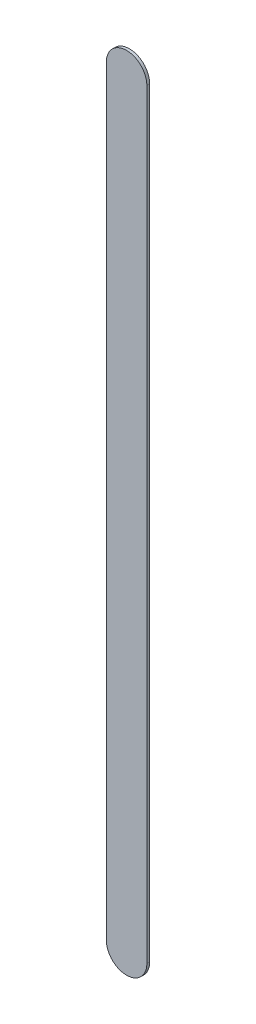
ISO-10303-21;
HEADER;
FILE_DESCRIPTION(('STEP AP214'),'2;1');
FILE_NAME('part.step','',(''),(''),'','','');
FILE_SCHEMA(('AUTOMOTIVE_DESIGN { 1 0 10303 214 1 1 1 1 }'));
ENDSEC;
DATA;
#1=APPLICATION_CONTEXT('core data for automotive mechanical design processes');
#2=APPLICATION_PROTOCOL_DEFINITION('international standard','automotive_design',2000,#1);
#3=PRODUCT_CONTEXT('',#1,'mechanical');
#4=PRODUCT('Part','Part','',(#3));
#5=PRODUCT_RELATED_PRODUCT_CATEGORY('part','',(#4));
#6=PRODUCT_DEFINITION_FORMATION('','',#4);
#7=PRODUCT_DEFINITION_CONTEXT('part definition',#1,'design');
#8=PRODUCT_DEFINITION('design','',#6,#7);
#9=PRODUCT_DEFINITION_SHAPE('','',#8);
#10=(LENGTH_UNIT() NAMED_UNIT(*) SI_UNIT(.MILLI.,.METRE.));
#11=(NAMED_UNIT(*) PLANE_ANGLE_UNIT() SI_UNIT($,.RADIAN.));
#12=(NAMED_UNIT(*) SI_UNIT($,.STERADIAN.) SOLID_ANGLE_UNIT());
#13=UNCERTAINTY_MEASURE_WITH_UNIT(LENGTH_MEASURE(1.E-05),#10,'distance_accuracy_value','');
#14=(GEOMETRIC_REPRESENTATION_CONTEXT(3) GLOBAL_UNCERTAINTY_ASSIGNED_CONTEXT((#13)) GLOBAL_UNIT_ASSIGNED_CONTEXT((#10,
#11,#12)) REPRESENTATION_CONTEXT('',''));
#15=CARTESIAN_POINT('',(0.,0.,0.));
#16=DIRECTION('',(0.,0.,1.));
#17=DIRECTION('',(1.,0.,0.));
#18=AXIS2_PLACEMENT_3D('',#15,#16,#17);
#19=CARTESIAN_POINT('',(138.44,-100.48,1.635));
#20=DIRECTION('',(0.,0.,1.));
#21=DIRECTION('',(1.,0.,0.));
#22=AXIS2_PLACEMENT_3D('',#19,#20,#21);
#23=PLANE('',#22);
#24=DIRECTION('',(0.,-1.,0.));
#25=VECTOR('',#24,1.);
#26=CARTESIAN_POINT('',(138.44,-100.48,1.635));
#27=LINE('',#26,#25);
#28=CARTESIAN_POINT('',(138.44,-100.48,1.635));
#29=VERTEX_POINT('',#28);
#30=CARTESIAN_POINT('',(138.44,-109.86,1.635));
#31=VERTEX_POINT('',#30);
#32=EDGE_CURVE('E70',#29,#31,#27,.T.);
#33=ORIENTED_EDGE('',*,*,#32,.T.);
#34=CARTESIAN_POINT('',(138.69,-109.86,1.635));
#35=DIRECTION('',(0.,0.,1.));
#36=DIRECTION('',(-1.,0.,0.));
#37=AXIS2_PLACEMENT_3D('',#34,#35,#36);
#38=CIRCLE('',#37,0.25);
#39=CARTESIAN_POINT('',(138.94,-109.86,1.635));
#40=VERTEX_POINT('',#39);
#41=EDGE_CURVE('E68',#31,#40,#38,.T.);
#42=ORIENTED_EDGE('',*,*,#41,.T.);
#43=DIRECTION('',(0.,1.,0.));
#44=VECTOR('',#43,1.);
#45=CARTESIAN_POINT('',(138.94,-109.86,1.635));
#46=LINE('',#45,#44);
#47=CARTESIAN_POINT('',(138.94,-100.48,1.635));
#48=VERTEX_POINT('',#47);
#49=EDGE_CURVE('E56',#40,#48,#46,.T.);
#50=ORIENTED_EDGE('',*,*,#49,.T.);
#51=CARTESIAN_POINT('',(138.69,-100.48,1.635));
#52=DIRECTION('',(0.,0.,1.));
#53=DIRECTION('',(1.,0.,0.));
#54=AXIS2_PLACEMENT_3D('',#51,#52,#53);
#55=CIRCLE('',#54,0.25);
#56=EDGE_CURVE('E11',#48,#29,#55,.T.);
#57=ORIENTED_EDGE('',*,*,#56,.T.);
#58=EDGE_LOOP('',(#33,#42,#50,#57));
#59=FACE_BOUND('',#58,.T.);
#60=ADVANCED_FACE('F17',(#59),#23,.T.);
#61=CARTESIAN_POINT('',(138.44,-100.48,1.6));
#62=DIRECTION('',(0.,0.,1.));
#63=DIRECTION('',(1.,0.,0.));
#64=AXIS2_PLACEMENT_3D('',#61,#62,#63);
#65=PLANE('',#64);
#66=CARTESIAN_POINT('',(138.69,-100.48,1.6));
#67=DIRECTION('',(0.,0.,1.));
#68=DIRECTION('',(1.,0.,0.));
#69=AXIS2_PLACEMENT_3D('',#66,#67,#68);
#70=CIRCLE('',#69,0.25);
#71=CARTESIAN_POINT('',(138.94,-100.48,1.6));
#72=VERTEX_POINT('',#71);
#73=CARTESIAN_POINT('',(138.44,-100.48,1.6));
#74=VERTEX_POINT('',#73);
#75=EDGE_CURVE('E26',#72,#74,#70,.T.);
#76=ORIENTED_EDGE('',*,*,#75,.F.);
#77=DIRECTION('',(0.,1.,0.));
#78=VECTOR('',#77,1.);
#79=CARTESIAN_POINT('',(138.94,-109.86,1.6));
#80=LINE('',#79,#78);
#81=CARTESIAN_POINT('',(138.94,-109.86,1.6));
#82=VERTEX_POINT('',#81);
#83=EDGE_CURVE('E75',#82,#72,#80,.T.);
#84=ORIENTED_EDGE('',*,*,#83,.F.);
#85=CARTESIAN_POINT('',(138.69,-109.86,1.6));
#86=DIRECTION('',(0.,0.,1.));
#87=DIRECTION('',(-1.,0.,0.));
#88=AXIS2_PLACEMENT_3D('',#85,#86,#87);
#89=CIRCLE('',#88,0.25);
#90=CARTESIAN_POINT('',(138.44,-109.86,1.6));
#91=VERTEX_POINT('',#90);
#92=EDGE_CURVE('E79',#91,#82,#89,.T.);
#93=ORIENTED_EDGE('',*,*,#92,.F.);
#94=DIRECTION('',(0.,-1.,0.));
#95=VECTOR('',#94,1.);
#96=CARTESIAN_POINT('',(138.44,-100.48,1.6));
#97=LINE('',#96,#95);
#98=EDGE_CURVE('E107',#74,#91,#97,.T.);
#99=ORIENTED_EDGE('',*,*,#98,.F.);
#100=EDGE_LOOP('',(#76,#84,#93,#99));
#101=FACE_BOUND('',#100,.T.);
#102=ADVANCED_FACE('F110',(#101),#65,.F.);
#103=CARTESIAN_POINT('',(138.69,-100.48,1.6));
#104=DIRECTION('',(0.,0.,-1.));
#105=DIRECTION('',(1.,0.,0.));
#106=AXIS2_PLACEMENT_3D('',#103,#104,#105);
#107=CYLINDRICAL_SURFACE('',#106,0.25);
#108=ORIENTED_EDGE('',*,*,#75,.T.);
#109=DIRECTION('',(0.,0.,1.));
#110=VECTOR('',#109,1.);
#111=CARTESIAN_POINT('',(138.44,-100.48,1.6));
#112=LINE('',#111,#110);
#113=EDGE_CURVE('E86',#74,#29,#112,.T.);
#114=ORIENTED_EDGE('',*,*,#113,.T.);
#115=ORIENTED_EDGE('',*,*,#56,.F.);
#116=DIRECTION('',(0.,0.,1.));
#117=VECTOR('',#116,1.);
#118=CARTESIAN_POINT('',(138.94,-100.48,1.6));
#119=LINE('',#118,#117);
#120=EDGE_CURVE('E63',#72,#48,#119,.T.);
#121=ORIENTED_EDGE('',*,*,#120,.F.);
#122=EDGE_LOOP('',(#108,#114,#115,#121));
#123=FACE_BOUND('',#122,.T.);
#124=ADVANCED_FACE('F98',(#123),#107,.T.);
#125=CARTESIAN_POINT('',(138.94,-109.86,1.6));
#126=DIRECTION('',(-1.,0.,0.));
#127=DIRECTION('',(0.,0.,1.));
#128=AXIS2_PLACEMENT_3D('',#125,#126,#127);
#129=PLANE('',#128);
#130=ORIENTED_EDGE('',*,*,#83,.T.);
#131=ORIENTED_EDGE('',*,*,#120,.T.);
#132=ORIENTED_EDGE('',*,*,#49,.F.);
#133=DIRECTION('',(0.,0.,1.));
#134=VECTOR('',#133,1.);
#135=CARTESIAN_POINT('',(138.94,-109.86,1.6));
#136=LINE('',#135,#134);
#137=EDGE_CURVE('E61',#82,#40,#136,.T.);
#138=ORIENTED_EDGE('',*,*,#137,.F.);
#139=EDGE_LOOP('',(#130,#131,#132,#138));
#140=FACE_BOUND('',#139,.T.);
#141=ADVANCED_FACE('F59',(#140),#129,.F.);
#142=CARTESIAN_POINT('',(138.69,-109.86,1.6));
#143=DIRECTION('',(0.,0.,-1.));
#144=DIRECTION('',(-1.,0.,0.));
#145=AXIS2_PLACEMENT_3D('',#142,#143,#144);
#146=CYLINDRICAL_SURFACE('',#145,0.25);
#147=ORIENTED_EDGE('',*,*,#92,.T.);
#148=ORIENTED_EDGE('',*,*,#137,.T.);
#149=ORIENTED_EDGE('',*,*,#41,.F.);
#150=DIRECTION('',(0.,0.,1.));
#151=VECTOR('',#150,1.);
#152=CARTESIAN_POINT('',(138.44,-109.86,1.6));
#153=LINE('',#152,#151);
#154=EDGE_CURVE('E112',#91,#31,#153,.T.);
#155=ORIENTED_EDGE('',*,*,#154,.F.);
#156=EDGE_LOOP('',(#147,#148,#149,#155));
#157=FACE_BOUND('',#156,.T.);
#158=ADVANCED_FACE('F77',(#157),#146,.T.);
#159=CARTESIAN_POINT('',(138.44,-100.48,1.6));
#160=DIRECTION('',(1.,0.,0.));
#161=DIRECTION('',(0.,1.,0.));
#162=AXIS2_PLACEMENT_3D('',#159,#160,#161);
#163=PLANE('',#162);
#164=ORIENTED_EDGE('',*,*,#98,.T.);
#165=ORIENTED_EDGE('',*,*,#154,.T.);
#166=ORIENTED_EDGE('',*,*,#32,.F.);
#167=ORIENTED_EDGE('',*,*,#113,.F.);
#168=EDGE_LOOP('',(#164,#165,#166,#167));
#169=FACE_BOUND('',#168,.T.);
#170=ADVANCED_FACE('F106',(#169),#163,.F.);
#171=CLOSED_SHELL('',(#60,#102,#124,#141,#158,#170));
#172=MANIFOLD_SOLID_BREP('B1',#171);
#173=ADVANCED_BREP_SHAPE_REPRESENTATION('',(#18,#172),#14);
#174=SHAPE_DEFINITION_REPRESENTATION(#9,#173);
ENDSEC;
END-ISO-10303-21;
